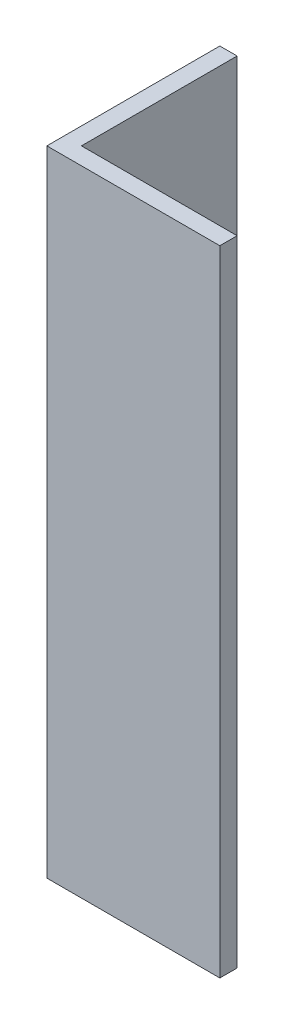
ISO-10303-21;
HEADER;
FILE_DESCRIPTION(('STEP AP214'),'2;1');
FILE_NAME('part.step','',(''),(''),'','','');
FILE_SCHEMA(('AUTOMOTIVE_DESIGN { 1 0 10303 214 1 1 1 1 }'));
ENDSEC;
DATA;
#1=APPLICATION_CONTEXT('core data for automotive mechanical design processes');
#2=APPLICATION_PROTOCOL_DEFINITION('international standard','automotive_design',2000,#1);
#3=PRODUCT_CONTEXT('',#1,'mechanical');
#4=PRODUCT('Part','Part','',(#3));
#5=PRODUCT_RELATED_PRODUCT_CATEGORY('part','',(#4));
#6=PRODUCT_DEFINITION_FORMATION('','',#4);
#7=PRODUCT_DEFINITION_CONTEXT('part definition',#1,'design');
#8=PRODUCT_DEFINITION('design','',#6,#7);
#9=PRODUCT_DEFINITION_SHAPE('','',#8);
#10=(LENGTH_UNIT() NAMED_UNIT(*) SI_UNIT(.MILLI.,.METRE.));
#11=(NAMED_UNIT(*) PLANE_ANGLE_UNIT() SI_UNIT($,.RADIAN.));
#12=(NAMED_UNIT(*) SI_UNIT($,.STERADIAN.) SOLID_ANGLE_UNIT());
#13=UNCERTAINTY_MEASURE_WITH_UNIT(LENGTH_MEASURE(1.E-05),#10,'distance_accuracy_value','');
#14=(GEOMETRIC_REPRESENTATION_CONTEXT(3) GLOBAL_UNCERTAINTY_ASSIGNED_CONTEXT((#13)) GLOBAL_UNIT_ASSIGNED_CONTEXT((#10,
#11,#12)) REPRESENTATION_CONTEXT('',''));
#15=CARTESIAN_POINT('',(0.,0.,0.));
#16=DIRECTION('',(0.,0.,1.));
#17=DIRECTION('',(1.,0.,0.));
#18=AXIS2_PLACEMENT_3D('',#15,#16,#17);
#19=CARTESIAN_POINT('',(-2.22044604925031E-13,109.999999999998,-30.0000000000005));
#20=DIRECTION('',(1.,0.,0.));
#21=DIRECTION('',(0.,0.,-1.));
#22=AXIS2_PLACEMENT_3D('',#19,#20,#21);
#23=PLANE('',#22);
#24=DIRECTION('',(0.,0.,1.));
#25=VECTOR('',#24,1.);
#26=CARTESIAN_POINT('',(4.44089209850063E-13,-2.66453525910038E-12,-29.9999999999991));
#27=LINE('',#26,#25);
#28=CARTESIAN_POINT('',(4.44089209850063E-13,-2.66453525910038E-12,-29.9999999999991));
#29=VERTEX_POINT('',#28);
#30=CARTESIAN_POINT('',(0.,0.,0.));
#31=VERTEX_POINT('',#30);
#32=EDGE_CURVE('E114',#29,#31,#27,.T.);
#33=ORIENTED_EDGE('',*,*,#32,.T.);
#34=DIRECTION('',(0.,-0.999999999999999,0.));
#35=VECTOR('',#34,1.);
#36=CARTESIAN_POINT('',(0.,109.999999999997,0.));
#37=LINE('',#36,#35);
#38=CARTESIAN_POINT('',(0.,109.999999999997,0.));
#39=VERTEX_POINT('',#38);
#40=EDGE_CURVE('E11',#39,#31,#37,.T.);
#41=ORIENTED_EDGE('',*,*,#40,.F.);
#42=DIRECTION('',(0.,0.,1.));
#43=VECTOR('',#42,1.);
#44=CARTESIAN_POINT('',(-2.22044604925031E-13,109.999999999998,-30.0000000000005));
#45=LINE('',#44,#43);
#46=CARTESIAN_POINT('',(-2.22044604925031E-13,109.999999999998,-30.0000000000005));
#47=VERTEX_POINT('',#46);
#48=EDGE_CURVE('E124',#47,#39,#45,.T.);
#49=ORIENTED_EDGE('',*,*,#48,.F.);
#50=DIRECTION('',(0.,-0.999999999999999,0.));
#51=VECTOR('',#50,1.);
#52=CARTESIAN_POINT('',(-2.22044604925031E-13,109.999999999998,-30.0000000000005));
#53=LINE('',#52,#51);
#54=EDGE_CURVE('E110',#47,#29,#53,.T.);
#55=ORIENTED_EDGE('',*,*,#54,.T.);
#56=EDGE_LOOP('',(#33,#41,#49,#55));
#57=FACE_BOUND('',#56,.T.);
#58=ADVANCED_FACE('F30',(#57),#23,.F.);
#59=CARTESIAN_POINT('',(0.,109.999999999997,0.));
#60=DIRECTION('',(0.,0.,-1.));
#61=DIRECTION('',(-1.,0.,0.));
#62=AXIS2_PLACEMENT_3D('',#59,#60,#61);
#63=PLANE('',#62);
#64=DIRECTION('',(1.,0.,0.));
#65=VECTOR('',#64,1.);
#66=CARTESIAN_POINT('',(0.,0.,0.));
#67=LINE('',#66,#65);
#68=CARTESIAN_POINT('',(30.0000000000007,-1.77635683940025E-12,2.22044604925031E-13));
#69=VERTEX_POINT('',#68);
#70=EDGE_CURVE('E117',#31,#69,#67,.T.);
#71=ORIENTED_EDGE('',*,*,#70,.T.);
#72=DIRECTION('',(0.,-0.999999999999999,0.));
#73=VECTOR('',#72,1.);
#74=CARTESIAN_POINT('',(30.0000000000002,109.999999999998,0.));
#75=LINE('',#74,#73);
#76=CARTESIAN_POINT('',(30.0000000000002,109.999999999998,0.));
#77=VERTEX_POINT('',#76);
#78=EDGE_CURVE('E38',#77,#69,#75,.T.);
#79=ORIENTED_EDGE('',*,*,#78,.F.);
#80=DIRECTION('',(1.,0.,0.));
#81=VECTOR('',#80,1.);
#82=CARTESIAN_POINT('',(0.,109.999999999997,0.));
#83=LINE('',#82,#81);
#84=EDGE_CURVE('E83',#39,#77,#83,.T.);
#85=ORIENTED_EDGE('',*,*,#84,.F.);
#86=ORIENTED_EDGE('',*,*,#40,.T.);
#87=EDGE_LOOP('',(#71,#79,#85,#86));
#88=FACE_BOUND('',#87,.T.);
#89=ADVANCED_FACE('F148',(#88),#63,.F.);
#90=CARTESIAN_POINT('',(30.0000000000002,109.999999999998,0.));
#91=DIRECTION('',(-1.,0.,0.));
#92=DIRECTION('',(0.,0.,1.));
#93=AXIS2_PLACEMENT_3D('',#90,#91,#92);
#94=PLANE('',#93);
#95=DIRECTION('',(0.,0.,-1.));
#96=VECTOR('',#95,1.);
#97=CARTESIAN_POINT('',(30.0000000000007,-1.77635683940025E-12,2.22044604925031E-13));
#98=LINE('',#97,#96);
#99=CARTESIAN_POINT('',(30.0000000000007,-1.77635683940025E-12,-3.00000000000011));
#100=VERTEX_POINT('',#99);
#101=EDGE_CURVE('E119',#69,#100,#98,.T.);
#102=ORIENTED_EDGE('',*,*,#101,.T.);
#103=DIRECTION('',(0.,-0.999999999999999,0.));
#104=VECTOR('',#103,1.);
#105=CARTESIAN_POINT('',(30.0000000000007,109.999999999995,-2.99999999999967));
#106=LINE('',#105,#104);
#107=CARTESIAN_POINT('',(30.0000000000007,109.999999999995,-2.99999999999967));
#108=VERTEX_POINT('',#107);
#109=EDGE_CURVE('E105',#108,#100,#106,.T.);
#110=ORIENTED_EDGE('',*,*,#109,.F.);
#111=DIRECTION('',(0.,0.,-1.));
#112=VECTOR('',#111,1.);
#113=CARTESIAN_POINT('',(30.0000000000002,109.999999999998,0.));
#114=LINE('',#113,#112);
#115=EDGE_CURVE('E96',#77,#108,#114,.T.);
#116=ORIENTED_EDGE('',*,*,#115,.F.);
#117=ORIENTED_EDGE('',*,*,#78,.T.);
#118=EDGE_LOOP('',(#102,#110,#116,#117));
#119=FACE_BOUND('',#118,.T.);
#120=ADVANCED_FACE('F130',(#119),#94,.F.);
#121=CARTESIAN_POINT('',(30.0000000000007,109.999999999995,-2.99999999999967));
#122=DIRECTION('',(0.,0.,1.));
#123=DIRECTION('',(1.,0.,0.));
#124=AXIS2_PLACEMENT_3D('',#121,#122,#123);
#125=PLANE('',#124);
#126=DIRECTION('',(-1.,0.,0.));
#127=VECTOR('',#126,1.);
#128=CARTESIAN_POINT('',(30.0000000000007,-1.77635683940025E-12,-3.00000000000011));
#129=LINE('',#128,#127);
#130=CARTESIAN_POINT('',(3.00000000000011,0.,-2.99999999999856));
#131=VERTEX_POINT('',#130);
#132=EDGE_CURVE('E104',#100,#131,#129,.T.);
#133=ORIENTED_EDGE('',*,*,#132,.T.);
#134=DIRECTION('',(0.,-0.999999999999999,0.));
#135=VECTOR('',#134,1.);
#136=CARTESIAN_POINT('',(2.99999999999967,109.999999999991,-2.99999999999945));
#137=LINE('',#136,#135);
#138=CARTESIAN_POINT('',(2.99999999999967,109.999999999991,-2.99999999999945));
#139=VERTEX_POINT('',#138);
#140=EDGE_CURVE('E101',#139,#131,#137,.T.);
#141=ORIENTED_EDGE('',*,*,#140,.F.);
#142=DIRECTION('',(-1.,0.,0.));
#143=VECTOR('',#142,1.);
#144=CARTESIAN_POINT('',(30.0000000000007,109.999999999995,-2.99999999999967));
#145=LINE('',#144,#143);
#146=EDGE_CURVE('E90',#108,#139,#145,.T.);
#147=ORIENTED_EDGE('',*,*,#146,.F.);
#148=ORIENTED_EDGE('',*,*,#109,.T.);
#149=EDGE_LOOP('',(#133,#141,#147,#148));
#150=FACE_BOUND('',#149,.T.);
#151=ADVANCED_FACE('F102',(#150),#125,.F.);
#152=CARTESIAN_POINT('',(2.99999999999967,109.999999999991,-2.99999999999945));
#153=DIRECTION('',(-1.,0.,0.));
#154=DIRECTION('',(0.,0.,1.));
#155=AXIS2_PLACEMENT_3D('',#152,#153,#154);
#156=PLANE('',#155);
#157=DIRECTION('',(0.,0.,-1.));
#158=VECTOR('',#157,1.);
#159=CARTESIAN_POINT('',(3.00000000000011,0.,-2.99999999999856));
#160=LINE('',#159,#158);
#161=CARTESIAN_POINT('',(3.00000000000056,-1.77635683940025E-12,-29.9999999999991));
#162=VERTEX_POINT('',#161);
#163=EDGE_CURVE('E69',#131,#162,#160,.T.);
#164=ORIENTED_EDGE('',*,*,#163,.T.);
#165=DIRECTION('',(0.,-0.999999999999999,0.));
#166=VECTOR('',#165,1.);
#167=CARTESIAN_POINT('',(3.00000000000011,109.999999999995,-30.0000000000002));
#168=LINE('',#167,#166);
#169=CARTESIAN_POINT('',(3.00000000000011,109.999999999995,-30.0000000000002));
#170=VERTEX_POINT('',#169);
#171=EDGE_CURVE('E106',#170,#162,#168,.T.);
#172=ORIENTED_EDGE('',*,*,#171,.F.);
#173=DIRECTION('',(0.,0.,-1.));
#174=VECTOR('',#173,1.);
#175=CARTESIAN_POINT('',(2.99999999999967,109.999999999991,-2.99999999999945));
#176=LINE('',#175,#174);
#177=EDGE_CURVE('E94',#139,#170,#176,.T.);
#178=ORIENTED_EDGE('',*,*,#177,.F.);
#179=ORIENTED_EDGE('',*,*,#140,.T.);
#180=EDGE_LOOP('',(#164,#172,#178,#179));
#181=FACE_BOUND('',#180,.T.);
#182=ADVANCED_FACE('F108',(#181),#156,.F.);
#183=CARTESIAN_POINT('',(3.00000000000011,109.999999999995,-30.0000000000002));
#184=DIRECTION('',(0.,0.,1.));
#185=DIRECTION('',(1.,0.,0.));
#186=AXIS2_PLACEMENT_3D('',#183,#184,#185);
#187=PLANE('',#186);
#188=DIRECTION('',(-1.,0.,0.));
#189=VECTOR('',#188,1.);
#190=CARTESIAN_POINT('',(3.00000000000056,-1.77635683940025E-12,-29.9999999999991));
#191=LINE('',#190,#189);
#192=EDGE_CURVE('E75',#162,#29,#191,.T.);
#193=ORIENTED_EDGE('',*,*,#192,.T.);
#194=ORIENTED_EDGE('',*,*,#54,.F.);
#195=DIRECTION('',(-1.,0.,0.));
#196=VECTOR('',#195,1.);
#197=CARTESIAN_POINT('',(3.00000000000011,109.999999999995,-30.0000000000002));
#198=LINE('',#197,#196);
#199=EDGE_CURVE('E46',#170,#47,#198,.T.);
#200=ORIENTED_EDGE('',*,*,#199,.F.);
#201=ORIENTED_EDGE('',*,*,#171,.T.);
#202=EDGE_LOOP('',(#193,#194,#200,#201));
#203=FACE_BOUND('',#202,.T.);
#204=ADVANCED_FACE('F137',(#203),#187,.F.);
#205=CARTESIAN_POINT('',(0.,109.999999999997,0.));
#206=DIRECTION('',(0.,0.999999999999999,0.));
#207=DIRECTION('',(0.,0.,1.));
#208=AXIS2_PLACEMENT_3D('',#205,#206,#207);
#209=PLANE('',#208);
#210=ORIENTED_EDGE('',*,*,#48,.T.);
#211=ORIENTED_EDGE('',*,*,#84,.T.);
#212=ORIENTED_EDGE('',*,*,#115,.T.);
#213=ORIENTED_EDGE('',*,*,#146,.T.);
#214=ORIENTED_EDGE('',*,*,#177,.T.);
#215=ORIENTED_EDGE('',*,*,#199,.T.);
#216=EDGE_LOOP('',(#210,#211,#212,#213,#214,#215));
#217=FACE_BOUND('',#216,.T.);
#218=ADVANCED_FACE('F92',(#217),#209,.T.);
#219=CARTESIAN_POINT('',(0.,0.,0.));
#220=DIRECTION('',(0.,0.999999999999999,0.));
#221=DIRECTION('',(0.,0.,1.));
#222=AXIS2_PLACEMENT_3D('',#219,#220,#221);
#223=PLANE('',#222);
#224=ORIENTED_EDGE('',*,*,#32,.F.);
#225=ORIENTED_EDGE('',*,*,#192,.F.);
#226=ORIENTED_EDGE('',*,*,#163,.F.);
#227=ORIENTED_EDGE('',*,*,#132,.F.);
#228=ORIENTED_EDGE('',*,*,#101,.F.);
#229=ORIENTED_EDGE('',*,*,#70,.F.);
#230=EDGE_LOOP('',(#224,#225,#226,#227,#228,#229));
#231=FACE_BOUND('',#230,.T.);
#232=ADVANCED_FACE('F133',(#231),#223,.F.);
#233=CLOSED_SHELL('',(#58,#89,#120,#151,#182,#204,#218,#232));
#234=MANIFOLD_SOLID_BREP('B2',#233);
#235=ADVANCED_BREP_SHAPE_REPRESENTATION('',(#18,#234),#14);
#236=SHAPE_DEFINITION_REPRESENTATION(#9,#235);
ENDSEC;
END-ISO-10303-21;
